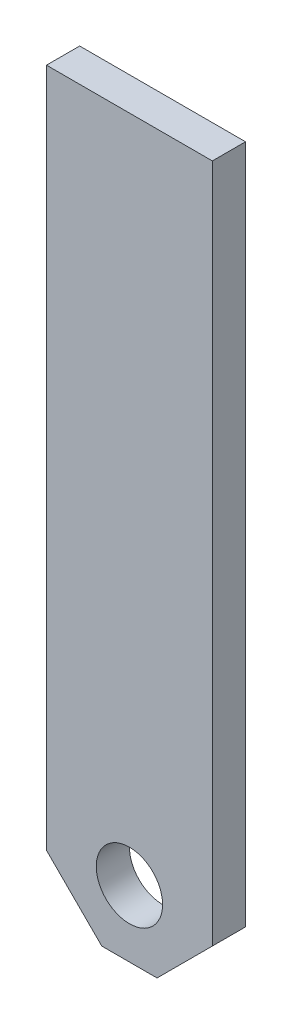
ISO-10303-21;
HEADER;
FILE_DESCRIPTION(('STEP AP214'),'2;1');
FILE_NAME('part.step','',(''),(''),'','','');
FILE_SCHEMA(('AUTOMOTIVE_DESIGN { 1 0 10303 214 1 1 1 1 }'));
ENDSEC;
DATA;
#1=APPLICATION_CONTEXT('core data for automotive mechanical design processes');
#2=APPLICATION_PROTOCOL_DEFINITION('international standard','automotive_design',2000,#1);
#3=PRODUCT_CONTEXT('',#1,'mechanical');
#4=PRODUCT('Part','Part','',(#3));
#5=PRODUCT_RELATED_PRODUCT_CATEGORY('part','',(#4));
#6=PRODUCT_DEFINITION_FORMATION('','',#4);
#7=PRODUCT_DEFINITION_CONTEXT('part definition',#1,'design');
#8=PRODUCT_DEFINITION('design','',#6,#7);
#9=PRODUCT_DEFINITION_SHAPE('','',#8);
#10=(LENGTH_UNIT() NAMED_UNIT(*) SI_UNIT(.MILLI.,.METRE.));
#11=(NAMED_UNIT(*) PLANE_ANGLE_UNIT() SI_UNIT($,.RADIAN.));
#12=(NAMED_UNIT(*) SI_UNIT($,.STERADIAN.) SOLID_ANGLE_UNIT());
#13=UNCERTAINTY_MEASURE_WITH_UNIT(LENGTH_MEASURE(1.E-05),#10,'distance_accuracy_value','');
#14=(GEOMETRIC_REPRESENTATION_CONTEXT(3) GLOBAL_UNCERTAINTY_ASSIGNED_CONTEXT((#13)) GLOBAL_UNIT_ASSIGNED_CONTEXT((#10,
#11,#12)) REPRESENTATION_CONTEXT('',''));
#15=CARTESIAN_POINT('',(0.,0.,0.));
#16=DIRECTION('',(0.,0.,1.));
#17=DIRECTION('',(1.,0.,0.));
#18=AXIS2_PLACEMENT_3D('',#15,#16,#17);
#19=CARTESIAN_POINT('',(-15.,0.,-6.));
#20=DIRECTION('',(-1.,0.,0.));
#21=DIRECTION('',(0.,-1.,0.));
#22=AXIS2_PLACEMENT_3D('',#19,#20,#21);
#23=PLANE('',#22);
#24=DIRECTION('',(0.,-1.,0.));
#25=VECTOR('',#24,1.);
#26=CARTESIAN_POINT('',(-15.,0.,-6.));
#27=LINE('',#26,#25);
#28=CARTESIAN_POINT('',(-15.,0.,-6.));
#29=VERTEX_POINT('',#28);
#30=CARTESIAN_POINT('',(-15.,-123.,-6.));
#31=VERTEX_POINT('',#30);
#32=EDGE_CURVE('E91',#29,#31,#27,.T.);
#33=ORIENTED_EDGE('',*,*,#32,.T.);
#34=DIRECTION('',(0.,0.,1.));
#35=VECTOR('',#34,1.);
#36=CARTESIAN_POINT('',(-15.,-123.,-6.));
#37=LINE('',#36,#35);
#38=CARTESIAN_POINT('',(-15.,-123.,0.));
#39=VERTEX_POINT('',#38);
#40=EDGE_CURVE('E118',#31,#39,#37,.T.);
#41=ORIENTED_EDGE('',*,*,#40,.T.);
#42=DIRECTION('',(0.,-1.,0.));
#43=VECTOR('',#42,1.);
#44=CARTESIAN_POINT('',(-15.,0.,0.));
#45=LINE('',#44,#43);
#46=CARTESIAN_POINT('',(-15.,0.,0.));
#47=VERTEX_POINT('',#46);
#48=EDGE_CURVE('E108',#47,#39,#45,.T.);
#49=ORIENTED_EDGE('',*,*,#48,.F.);
#50=DIRECTION('',(0.,0.,1.));
#51=VECTOR('',#50,1.);
#52=CARTESIAN_POINT('',(-15.,0.,-6.));
#53=LINE('',#52,#51);
#54=EDGE_CURVE('E100',#29,#47,#53,.T.);
#55=ORIENTED_EDGE('',*,*,#54,.F.);
#56=EDGE_LOOP('',(#33,#41,#49,#55));
#57=FACE_BOUND('',#56,.T.);
#58=ADVANCED_FACE('F33',(#57),#23,.T.);
#59=CARTESIAN_POINT('',(-15.,0.,-6.));
#60=DIRECTION('',(0.,-1.,0.));
#61=DIRECTION('',(0.,0.,-1.));
#62=AXIS2_PLACEMENT_3D('',#59,#60,#61);
#63=PLANE('',#62);
#64=DIRECTION('',(1.,0.,0.));
#65=VECTOR('',#64,1.);
#66=CARTESIAN_POINT('',(-15.,0.,0.));
#67=LINE('',#66,#65);
#68=CARTESIAN_POINT('',(15.,0.,0.));
#69=VERTEX_POINT('',#68);
#70=EDGE_CURVE('E98',#47,#69,#67,.T.);
#71=ORIENTED_EDGE('',*,*,#70,.T.);
#72=DIRECTION('',(0.,0.,1.));
#73=VECTOR('',#72,1.);
#74=CARTESIAN_POINT('',(15.,0.,-6.));
#75=LINE('',#74,#73);
#76=CARTESIAN_POINT('',(15.,0.,-6.));
#77=VERTEX_POINT('',#76);
#78=EDGE_CURVE('E93',#77,#69,#75,.T.);
#79=ORIENTED_EDGE('',*,*,#78,.F.);
#80=DIRECTION('',(1.,0.,0.));
#81=VECTOR('',#80,1.);
#82=CARTESIAN_POINT('',(-15.,0.,-6.));
#83=LINE('',#82,#81);
#84=EDGE_CURVE('E86',#29,#77,#83,.T.);
#85=ORIENTED_EDGE('',*,*,#84,.F.);
#86=ORIENTED_EDGE('',*,*,#54,.T.);
#87=EDGE_LOOP('',(#71,#79,#85,#86));
#88=FACE_BOUND('',#87,.T.);
#89=ADVANCED_FACE('F96',(#88),#63,.F.);
#90=CARTESIAN_POINT('',(15.,0.,-6.));
#91=DIRECTION('',(-1.,0.,0.));
#92=DIRECTION('',(0.,-1.,0.));
#93=AXIS2_PLACEMENT_3D('',#90,#91,#92);
#94=PLANE('',#93);
#95=DIRECTION('',(0.,-1.,0.));
#96=VECTOR('',#95,1.);
#97=CARTESIAN_POINT('',(15.,0.,0.));
#98=LINE('',#97,#96);
#99=CARTESIAN_POINT('',(15.,-123.,0.));
#100=VERTEX_POINT('',#99);
#101=EDGE_CURVE('E115',#69,#100,#98,.T.);
#102=ORIENTED_EDGE('',*,*,#101,.T.);
#103=DIRECTION('',(0.,0.,-1.));
#104=VECTOR('',#103,1.);
#105=CARTESIAN_POINT('',(15.,-123.,-6.));
#106=LINE('',#105,#104);
#107=CARTESIAN_POINT('',(15.,-123.,-6.));
#108=VERTEX_POINT('',#107);
#109=EDGE_CURVE('E11',#100,#108,#106,.T.);
#110=ORIENTED_EDGE('',*,*,#109,.T.);
#111=DIRECTION('',(0.,-1.,0.));
#112=VECTOR('',#111,1.);
#113=CARTESIAN_POINT('',(15.,0.,-6.));
#114=LINE('',#113,#112);
#115=EDGE_CURVE('E89',#77,#108,#114,.T.);
#116=ORIENTED_EDGE('',*,*,#115,.F.);
#117=ORIENTED_EDGE('',*,*,#78,.T.);
#118=EDGE_LOOP('',(#102,#110,#116,#117));
#119=FACE_BOUND('',#118,.T.);
#120=ADVANCED_FACE('F102',(#119),#94,.F.);
#121=CARTESIAN_POINT('',(-15.,-133.,-6.));
#122=DIRECTION('',(0.,-1.,0.));
#123=DIRECTION('',(0.,0.,-1.));
#124=AXIS2_PLACEMENT_3D('',#121,#122,#123);
#125=PLANE('',#124);
#126=DIRECTION('',(1.,0.,0.));
#127=VECTOR('',#126,1.);
#128=CARTESIAN_POINT('',(-15.,-133.,0.));
#129=LINE('',#128,#127);
#130=CARTESIAN_POINT('',(-4.99999999999995,-133.,0.));
#131=VERTEX_POINT('',#130);
#132=CARTESIAN_POINT('',(5.00000000000007,-133.,0.));
#133=VERTEX_POINT('',#132);
#134=EDGE_CURVE('E111',#131,#133,#129,.T.);
#135=ORIENTED_EDGE('',*,*,#134,.F.);
#136=DIRECTION('',(0.,0.,-1.));
#137=VECTOR('',#136,1.);
#138=CARTESIAN_POINT('',(-4.99999999999995,-133.,-6.));
#139=LINE('',#138,#137);
#140=CARTESIAN_POINT('',(-4.99999999999995,-133.,-6.));
#141=VERTEX_POINT('',#140);
#142=EDGE_CURVE('E129',#131,#141,#139,.T.);
#143=ORIENTED_EDGE('',*,*,#142,.T.);
#144=DIRECTION('',(1.,0.,0.));
#145=VECTOR('',#144,1.);
#146=CARTESIAN_POINT('',(-15.,-133.,-6.));
#147=LINE('',#146,#145);
#148=CARTESIAN_POINT('',(5.00000000000007,-133.,-6.));
#149=VERTEX_POINT('',#148);
#150=EDGE_CURVE('E103',#141,#149,#147,.T.);
#151=ORIENTED_EDGE('',*,*,#150,.T.);
#152=DIRECTION('',(0.,0.,1.));
#153=VECTOR('',#152,1.);
#154=CARTESIAN_POINT('',(5.00000000000007,-133.,0.));
#155=LINE('',#154,#153);
#156=EDGE_CURVE('E126',#149,#133,#155,.T.);
#157=ORIENTED_EDGE('',*,*,#156,.T.);
#158=EDGE_LOOP('',(#135,#143,#151,#157));
#159=FACE_BOUND('',#158,.T.);
#160=ADVANCED_FACE('F142',(#159),#125,.T.);
#161=CARTESIAN_POINT('',(-15.,-133.,-6.));
#162=DIRECTION('',(0.,0.,1.));
#163=DIRECTION('',(1.,0.,0.));
#164=AXIS2_PLACEMENT_3D('',#161,#162,#163);
#165=PLANE('',#164);
#166=CARTESIAN_POINT('',(0.,-121.,-6.));
#167=DIRECTION('',(0.,0.,1.));
#168=DIRECTION('',(1.,0.,0.));
#169=AXIS2_PLACEMENT_3D('',#166,#167,#168);
#170=CIRCLE('',#169,6.);
#171=CARTESIAN_POINT('',(6.,-121.,-6.));
#172=VERTEX_POINT('',#171);
#173=EDGE_CURVE('E112',#172,#172,#170,.T.);
#174=ORIENTED_EDGE('',*,*,#173,.T.);
#175=EDGE_LOOP('',(#174));
#176=FACE_BOUND('',#175,.T.);
#177=ORIENTED_EDGE('',*,*,#150,.F.);
#178=DIRECTION('',(0.707106781186549,-0.707106781186546,0.));
#179=VECTOR('',#178,1.);
#180=CARTESIAN_POINT('',(-15.,-123.,-6.));
#181=LINE('',#180,#179);
#182=EDGE_CURVE('E41',#141,#31,#181,.F.);
#183=ORIENTED_EDGE('',*,*,#182,.T.);
#184=ORIENTED_EDGE('',*,*,#32,.F.);
#185=ORIENTED_EDGE('',*,*,#84,.T.);
#186=ORIENTED_EDGE('',*,*,#115,.T.);
#187=DIRECTION('',(-0.707106781186547,-0.707106781186548,0.));
#188=VECTOR('',#187,1.);
#189=CARTESIAN_POINT('',(5.00000000000007,-133.,-6.));
#190=LINE('',#189,#188);
#191=EDGE_CURVE('E53',#108,#149,#190,.T.);
#192=ORIENTED_EDGE('',*,*,#191,.T.);
#193=EDGE_LOOP('',(#177,#183,#184,#185,#186,#192));
#194=FACE_BOUND('',#193,.T.);
#195=ADVANCED_FACE('F88',(#176,#194),#165,.F.);
#196=CARTESIAN_POINT('',(-15.,-133.,0.));
#197=DIRECTION('',(0.,0.,1.));
#198=DIRECTION('',(1.,0.,0.));
#199=AXIS2_PLACEMENT_3D('',#196,#197,#198);
#200=PLANE('',#199);
#201=CARTESIAN_POINT('',(0.,-121.,0.));
#202=DIRECTION('',(0.,0.,1.));
#203=DIRECTION('',(1.,0.,0.));
#204=AXIS2_PLACEMENT_3D('',#201,#202,#203);
#205=CIRCLE('',#204,6.);
#206=CARTESIAN_POINT('',(6.,-121.,0.));
#207=VERTEX_POINT('',#206);
#208=EDGE_CURVE('E173',#207,#207,#205,.T.);
#209=ORIENTED_EDGE('',*,*,#208,.F.);
#210=EDGE_LOOP('',(#209));
#211=FACE_BOUND('',#210,.T.);
#212=ORIENTED_EDGE('',*,*,#48,.T.);
#213=DIRECTION('',(-0.707106781186549,0.707106781186546,0.));
#214=VECTOR('',#213,1.);
#215=CARTESIAN_POINT('',(-9.99999999999999,-128.,0.));
#216=LINE('',#215,#214);
#217=EDGE_CURVE('E124',#39,#131,#216,.F.);
#218=ORIENTED_EDGE('',*,*,#217,.T.);
#219=ORIENTED_EDGE('',*,*,#134,.T.);
#220=DIRECTION('',(0.707106781186547,0.707106781186548,0.));
#221=VECTOR('',#220,1.);
#222=CARTESIAN_POINT('',(-4.99999999999994,-143.,0.));
#223=LINE('',#222,#221);
#224=EDGE_CURVE('E122',#133,#100,#223,.T.);
#225=ORIENTED_EDGE('',*,*,#224,.T.);
#226=ORIENTED_EDGE('',*,*,#101,.F.);
#227=ORIENTED_EDGE('',*,*,#70,.F.);
#228=EDGE_LOOP('',(#212,#218,#219,#225,#226,#227));
#229=FACE_BOUND('',#228,.T.);
#230=ADVANCED_FACE('F140',(#211,#229),#200,.T.);
#231=CARTESIAN_POINT('',(-15.,-123.,-6.));
#232=DIRECTION('',(0.707106781186546,0.707106781186549,0.));
#233=DIRECTION('',(-0.707106781186549,0.707106781186546,0.));
#234=AXIS2_PLACEMENT_3D('',#231,#232,#233);
#235=PLANE('',#234);
#236=ORIENTED_EDGE('',*,*,#182,.F.);
#237=ORIENTED_EDGE('',*,*,#142,.F.);
#238=ORIENTED_EDGE('',*,*,#217,.F.);
#239=ORIENTED_EDGE('',*,*,#40,.F.);
#240=EDGE_LOOP('',(#236,#237,#238,#239));
#241=FACE_BOUND('',#240,.T.);
#242=ADVANCED_FACE('F137',(#241),#235,.F.);
#243=CARTESIAN_POINT('',(5.00000000000007,-133.,-6.));
#244=DIRECTION('',(0.707106781186548,-0.707106781186547,0.));
#245=DIRECTION('',(0.707106781186547,0.707106781186548,0.));
#246=AXIS2_PLACEMENT_3D('',#243,#244,#245);
#247=PLANE('',#246);
#248=ORIENTED_EDGE('',*,*,#191,.F.);
#249=ORIENTED_EDGE('',*,*,#109,.F.);
#250=ORIENTED_EDGE('',*,*,#224,.F.);
#251=ORIENTED_EDGE('',*,*,#156,.F.);
#252=EDGE_LOOP('',(#248,#249,#250,#251));
#253=FACE_BOUND('',#252,.T.);
#254=ADVANCED_FACE('F35',(#253),#247,.T.);
#255=CARTESIAN_POINT('',(0.,-121.,-6.));
#256=DIRECTION('',(0.,0.,1.));
#257=DIRECTION('',(1.,0.,0.));
#258=AXIS2_PLACEMENT_3D('',#255,#256,#257);
#259=CYLINDRICAL_SURFACE('',#258,6.);
#260=ORIENTED_EDGE('',*,*,#173,.F.);
#261=EDGE_LOOP('',(#260));
#262=FACE_BOUND('',#261,.T.);
#263=ORIENTED_EDGE('',*,*,#208,.T.);
#264=EDGE_LOOP('',(#263));
#265=FACE_BOUND('',#264,.T.);
#266=ADVANCED_FACE('F146',(#262,#265),#259,.F.);
#267=CLOSED_SHELL('',(#58,#89,#120,#160,#195,#230,#242,#254,#266));
#268=MANIFOLD_SOLID_BREP('B2',#267);
#269=ADVANCED_BREP_SHAPE_REPRESENTATION('',(#18,#268),#14);
#270=SHAPE_DEFINITION_REPRESENTATION(#9,#269);
ENDSEC;
END-ISO-10303-21;
